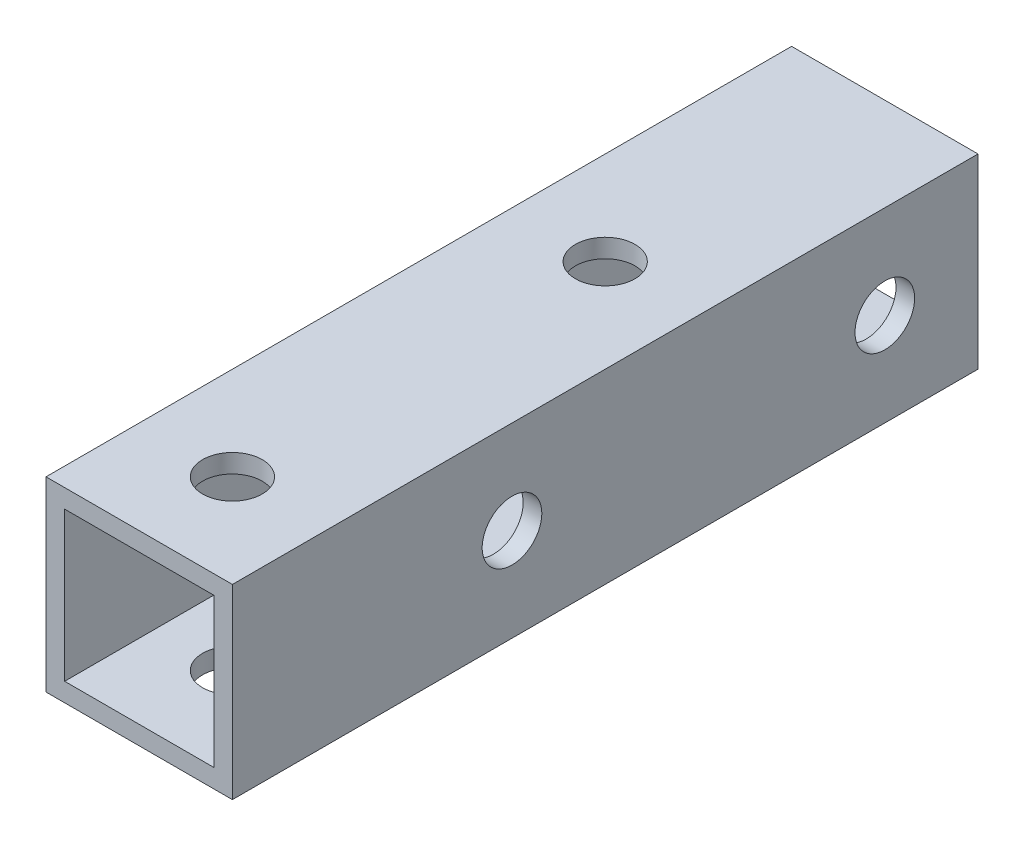
ISO-10303-21;
HEADER;
FILE_DESCRIPTION(('STEP AP214'),'2;1');
FILE_NAME('part.step','',(''),(''),'','','');
FILE_SCHEMA(('AUTOMOTIVE_DESIGN { 1 0 10303 214 1 1 1 1 }'));
ENDSEC;
DATA;
#1=APPLICATION_CONTEXT('core data for automotive mechanical design processes');
#2=APPLICATION_PROTOCOL_DEFINITION('international standard','automotive_design',2000,#1);
#3=PRODUCT_CONTEXT('',#1,'mechanical');
#4=PRODUCT('Part','Part','',(#3));
#5=PRODUCT_RELATED_PRODUCT_CATEGORY('part','',(#4));
#6=PRODUCT_DEFINITION_FORMATION('','',#4);
#7=PRODUCT_DEFINITION_CONTEXT('part definition',#1,'design');
#8=PRODUCT_DEFINITION('design','',#6,#7);
#9=PRODUCT_DEFINITION_SHAPE('','',#8);
#10=(LENGTH_UNIT() NAMED_UNIT(*) SI_UNIT(.MILLI.,.METRE.));
#11=(NAMED_UNIT(*) PLANE_ANGLE_UNIT() SI_UNIT($,.RADIAN.));
#12=(NAMED_UNIT(*) SI_UNIT($,.STERADIAN.) SOLID_ANGLE_UNIT());
#13=UNCERTAINTY_MEASURE_WITH_UNIT(LENGTH_MEASURE(1.E-05),#10,'distance_accuracy_value','');
#14=(GEOMETRIC_REPRESENTATION_CONTEXT(3) GLOBAL_UNCERTAINTY_ASSIGNED_CONTEXT((#13)) GLOBAL_UNIT_ASSIGNED_CONTEXT((#10,
#11,#12)) REPRESENTATION_CONTEXT('',''));
#15=CARTESIAN_POINT('',(0.,0.,0.));
#16=DIRECTION('',(0.,0.,1.));
#17=DIRECTION('',(1.,0.,0.));
#18=AXIS2_PLACEMENT_3D('',#15,#16,#17);
#19=CARTESIAN_POINT('',(0.,0.,40.));
#20=DIRECTION('',(0.,0.,1.));
#21=DIRECTION('',(1.,0.,0.));
#22=AXIS2_PLACEMENT_3D('',#19,#20,#21);
#23=PLANE('',#22);
#24=DIRECTION('',(0.,1.,0.));
#25=VECTOR('',#24,1.);
#26=CARTESIAN_POINT('',(5.,-5.,40.));
#27=LINE('',#26,#25);
#28=CARTESIAN_POINT('',(5.,-5.,40.));
#29=VERTEX_POINT('',#28);
#30=CARTESIAN_POINT('',(5.,5.,40.));
#31=VERTEX_POINT('',#30);
#32=EDGE_CURVE('E162',#29,#31,#27,.T.);
#33=ORIENTED_EDGE('',*,*,#32,.T.);
#34=DIRECTION('',(-1.,0.,0.));
#35=VECTOR('',#34,1.);
#36=CARTESIAN_POINT('',(-5.,5.,40.));
#37=LINE('',#36,#35);
#38=CARTESIAN_POINT('',(-5.,5.,40.));
#39=VERTEX_POINT('',#38);
#40=EDGE_CURVE('E165',#31,#39,#37,.T.);
#41=ORIENTED_EDGE('',*,*,#40,.T.);
#42=DIRECTION('',(0.,-1.,0.));
#43=VECTOR('',#42,1.);
#44=CARTESIAN_POINT('',(-5.,-5.,40.));
#45=LINE('',#44,#43);
#46=CARTESIAN_POINT('',(-5.,-5.,40.));
#47=VERTEX_POINT('',#46);
#48=EDGE_CURVE('E168',#39,#47,#45,.T.);
#49=ORIENTED_EDGE('',*,*,#48,.T.);
#50=DIRECTION('',(1.,0.,0.));
#51=VECTOR('',#50,1.);
#52=CARTESIAN_POINT('',(-5.,-5.,40.));
#53=LINE('',#52,#51);
#54=EDGE_CURVE('E170',#47,#29,#53,.T.);
#55=ORIENTED_EDGE('',*,*,#54,.T.);
#56=EDGE_LOOP('',(#33,#41,#49,#55));
#57=FACE_BOUND('',#56,.T.);
#58=DIRECTION('',(-1.,0.,0.));
#59=VECTOR('',#58,1.);
#60=CARTESIAN_POINT('',(0.,4.,40.));
#61=LINE('',#60,#59);
#62=CARTESIAN_POINT('',(4.,4.,40.));
#63=VERTEX_POINT('',#62);
#64=CARTESIAN_POINT('',(-4.,4.,40.));
#65=VERTEX_POINT('',#64);
#66=EDGE_CURVE('E132',#63,#65,#61,.T.);
#67=ORIENTED_EDGE('',*,*,#66,.F.);
#68=DIRECTION('',(0.,1.,0.));
#69=VECTOR('',#68,1.);
#70=CARTESIAN_POINT('',(4.,0.,40.));
#71=LINE('',#70,#69);
#72=CARTESIAN_POINT('',(4.,-4.,40.));
#73=VERTEX_POINT('',#72);
#74=EDGE_CURVE('E124',#73,#63,#71,.T.);
#75=ORIENTED_EDGE('',*,*,#74,.F.);
#76=DIRECTION('',(1.,0.,0.));
#77=VECTOR('',#76,1.);
#78=CARTESIAN_POINT('',(0.,-4.,40.));
#79=LINE('',#78,#77);
#80=CARTESIAN_POINT('',(-4.,-4.,40.));
#81=VERTEX_POINT('',#80);
#82=EDGE_CURVE('E146',#81,#73,#79,.T.);
#83=ORIENTED_EDGE('',*,*,#82,.F.);
#84=DIRECTION('',(0.,-1.,0.));
#85=VECTOR('',#84,1.);
#86=CARTESIAN_POINT('',(-4.,0.,40.));
#87=LINE('',#86,#85);
#88=EDGE_CURVE('E144',#65,#81,#87,.T.);
#89=ORIENTED_EDGE('',*,*,#88,.F.);
#90=EDGE_LOOP('',(#67,#75,#83,#89));
#91=FACE_BOUND('',#90,.T.);
#92=ADVANCED_FACE('F57',(#57,#91),#23,.T.);
#93=CARTESIAN_POINT('',(0.,0.,0.));
#94=DIRECTION('',(0.,0.,1.));
#95=DIRECTION('',(1.,0.,0.));
#96=AXIS2_PLACEMENT_3D('',#93,#94,#95);
#97=PLANE('',#96);
#98=DIRECTION('',(0.,1.,0.));
#99=VECTOR('',#98,1.);
#100=CARTESIAN_POINT('',(5.,-5.,0.));
#101=LINE('',#100,#99);
#102=CARTESIAN_POINT('',(5.,-5.,0.));
#103=VERTEX_POINT('',#102);
#104=CARTESIAN_POINT('',(5.,5.,0.));
#105=VERTEX_POINT('',#104);
#106=EDGE_CURVE('E140',#103,#105,#101,.T.);
#107=ORIENTED_EDGE('',*,*,#106,.F.);
#108=DIRECTION('',(1.,0.,0.));
#109=VECTOR('',#108,1.);
#110=CARTESIAN_POINT('',(-5.,-5.,0.));
#111=LINE('',#110,#109);
#112=CARTESIAN_POINT('',(-5.,-5.,0.));
#113=VERTEX_POINT('',#112);
#114=EDGE_CURVE('E166',#113,#103,#111,.T.);
#115=ORIENTED_EDGE('',*,*,#114,.F.);
#116=DIRECTION('',(0.,-1.,0.));
#117=VECTOR('',#116,1.);
#118=CARTESIAN_POINT('',(-5.,-5.,0.));
#119=LINE('',#118,#117);
#120=CARTESIAN_POINT('',(-5.,5.,0.));
#121=VERTEX_POINT('',#120);
#122=EDGE_CURVE('E177',#121,#113,#119,.T.);
#123=ORIENTED_EDGE('',*,*,#122,.F.);
#124=DIRECTION('',(-1.,0.,0.));
#125=VECTOR('',#124,1.);
#126=CARTESIAN_POINT('',(-5.,5.,0.));
#127=LINE('',#126,#125);
#128=EDGE_CURVE('E175',#105,#121,#127,.T.);
#129=ORIENTED_EDGE('',*,*,#128,.F.);
#130=EDGE_LOOP('',(#107,#115,#123,#129));
#131=FACE_BOUND('',#130,.T.);
#132=DIRECTION('',(0.,1.,0.));
#133=VECTOR('',#132,1.);
#134=CARTESIAN_POINT('',(4.,0.,0.));
#135=LINE('',#134,#133);
#136=CARTESIAN_POINT('',(4.,-4.,0.));
#137=VERTEX_POINT('',#136);
#138=CARTESIAN_POINT('',(4.,4.,0.));
#139=VERTEX_POINT('',#138);
#140=EDGE_CURVE('E82',#137,#139,#135,.T.);
#141=ORIENTED_EDGE('',*,*,#140,.T.);
#142=DIRECTION('',(-1.,0.,0.));
#143=VECTOR('',#142,1.);
#144=CARTESIAN_POINT('',(0.,4.,0.));
#145=LINE('',#144,#143);
#146=CARTESIAN_POINT('',(-4.,4.,0.));
#147=VERTEX_POINT('',#146);
#148=EDGE_CURVE('E139',#139,#147,#145,.T.);
#149=ORIENTED_EDGE('',*,*,#148,.T.);
#150=DIRECTION('',(0.,-1.,0.));
#151=VECTOR('',#150,1.);
#152=CARTESIAN_POINT('',(-4.,0.,0.));
#153=LINE('',#152,#151);
#154=CARTESIAN_POINT('',(-4.,-4.,0.));
#155=VERTEX_POINT('',#154);
#156=EDGE_CURVE('E154',#147,#155,#153,.T.);
#157=ORIENTED_EDGE('',*,*,#156,.T.);
#158=DIRECTION('',(1.,0.,0.));
#159=VECTOR('',#158,1.);
#160=CARTESIAN_POINT('',(0.,-4.,0.));
#161=LINE('',#160,#159);
#162=EDGE_CURVE('E133',#155,#137,#161,.T.);
#163=ORIENTED_EDGE('',*,*,#162,.T.);
#164=EDGE_LOOP('',(#141,#149,#157,#163));
#165=FACE_BOUND('',#164,.T.);
#166=ADVANCED_FACE('F265',(#131,#165),#97,.F.);
#167=CARTESIAN_POINT('',(5.,-5.,40.));
#168=DIRECTION('',(-1.,0.,0.));
#169=DIRECTION('',(0.,0.,1.));
#170=AXIS2_PLACEMENT_3D('',#167,#168,#169);
#171=PLANE('',#170);
#172=CARTESIAN_POINT('',(5.,0.,5.));
#173=DIRECTION('',(1.,0.,0.));
#174=DIRECTION('',(0.,0.,-1.));
#175=AXIS2_PLACEMENT_3D('',#172,#173,#174);
#176=CIRCLE('',#175,1.6);
#177=CARTESIAN_POINT('',(5.,0.,3.4));
#178=VERTEX_POINT('',#177);
#179=EDGE_CURVE('E203',#178,#178,#176,.T.);
#180=ORIENTED_EDGE('',*,*,#179,.F.);
#181=EDGE_LOOP('',(#180));
#182=FACE_BOUND('',#181,.T.);
#183=CARTESIAN_POINT('',(5.,0.,25.));
#184=DIRECTION('',(1.,0.,0.));
#185=DIRECTION('',(0.,0.,-1.));
#186=AXIS2_PLACEMENT_3D('',#183,#184,#185);
#187=CIRCLE('',#186,1.6);
#188=CARTESIAN_POINT('',(5.,0.,23.4));
#189=VERTEX_POINT('',#188);
#190=EDGE_CURVE('E213',#189,#189,#187,.T.);
#191=ORIENTED_EDGE('',*,*,#190,.F.);
#192=EDGE_LOOP('',(#191));
#193=FACE_BOUND('',#192,.T.);
#194=ORIENTED_EDGE('',*,*,#106,.T.);
#195=DIRECTION('',(0.,0.,-1.));
#196=VECTOR('',#195,1.);
#197=CARTESIAN_POINT('',(5.,5.,40.));
#198=LINE('',#197,#196);
#199=EDGE_CURVE('E12',#31,#105,#198,.T.);
#200=ORIENTED_EDGE('',*,*,#199,.F.);
#201=ORIENTED_EDGE('',*,*,#32,.F.);
#202=DIRECTION('',(0.,0.,-1.));
#203=VECTOR('',#202,1.);
#204=CARTESIAN_POINT('',(5.,-5.,40.));
#205=LINE('',#204,#203);
#206=EDGE_CURVE('E172',#29,#103,#205,.T.);
#207=ORIENTED_EDGE('',*,*,#206,.T.);
#208=EDGE_LOOP('',(#194,#200,#201,#207));
#209=FACE_BOUND('',#208,.T.);
#210=ADVANCED_FACE('F59',(#182,#193,#209),#171,.F.);
#211=CARTESIAN_POINT('',(-5.,5.,40.));
#212=DIRECTION('',(0.,-1.,0.));
#213=DIRECTION('',(0.,0.,-1.));
#214=AXIS2_PLACEMENT_3D('',#211,#212,#213);
#215=PLANE('',#214);
#216=CARTESIAN_POINT('',(0.,5.,15.));
#217=DIRECTION('',(0.,1.,0.));
#218=DIRECTION('',(0.,0.,1.));
#219=AXIS2_PLACEMENT_3D('',#216,#217,#218);
#220=CIRCLE('',#219,1.6);
#221=CARTESIAN_POINT('',(0.,5.,16.6));
#222=VERTEX_POINT('',#221);
#223=EDGE_CURVE('E222',#222,#222,#220,.T.);
#224=ORIENTED_EDGE('',*,*,#223,.F.);
#225=EDGE_LOOP('',(#224));
#226=FACE_BOUND('',#225,.T.);
#227=CARTESIAN_POINT('',(0.,5.,35.));
#228=DIRECTION('',(0.,1.,0.));
#229=DIRECTION('',(0.,0.,1.));
#230=AXIS2_PLACEMENT_3D('',#227,#228,#229);
#231=CIRCLE('',#230,1.6);
#232=CARTESIAN_POINT('',(0.,5.,36.6));
#233=VERTEX_POINT('',#232);
#234=EDGE_CURVE('E219',#233,#233,#231,.T.);
#235=ORIENTED_EDGE('',*,*,#234,.F.);
#236=EDGE_LOOP('',(#235));
#237=FACE_BOUND('',#236,.T.);
#238=ORIENTED_EDGE('',*,*,#128,.T.);
#239=DIRECTION('',(0.,0.,-1.));
#240=VECTOR('',#239,1.);
#241=CARTESIAN_POINT('',(-5.,5.,40.));
#242=LINE('',#241,#240);
#243=EDGE_CURVE('E66',#39,#121,#242,.T.);
#244=ORIENTED_EDGE('',*,*,#243,.F.);
#245=ORIENTED_EDGE('',*,*,#40,.F.);
#246=ORIENTED_EDGE('',*,*,#199,.T.);
#247=EDGE_LOOP('',(#238,#244,#245,#246));
#248=FACE_BOUND('',#247,.T.);
#249=ADVANCED_FACE('F251',(#226,#237,#248),#215,.F.);
#250=CARTESIAN_POINT('',(-5.,-5.,40.));
#251=DIRECTION('',(1.,0.,0.));
#252=DIRECTION('',(0.,0.,-1.));
#253=AXIS2_PLACEMENT_3D('',#250,#251,#252);
#254=PLANE('',#253);
#255=CARTESIAN_POINT('',(-5.,0.,5.));
#256=DIRECTION('',(1.,0.,0.));
#257=DIRECTION('',(0.,0.,-1.));
#258=AXIS2_PLACEMENT_3D('',#255,#256,#257);
#259=CIRCLE('',#258,1.6);
#260=CARTESIAN_POINT('',(-5.,0.,3.4));
#261=VERTEX_POINT('',#260);
#262=EDGE_CURVE('E197',#261,#261,#259,.T.);
#263=ORIENTED_EDGE('',*,*,#262,.T.);
#264=EDGE_LOOP('',(#263));
#265=FACE_BOUND('',#264,.T.);
#266=CARTESIAN_POINT('',(-5.,0.,25.));
#267=DIRECTION('',(1.,0.,0.));
#268=DIRECTION('',(0.,0.,-1.));
#269=AXIS2_PLACEMENT_3D('',#266,#267,#268);
#270=CIRCLE('',#269,1.6);
#271=CARTESIAN_POINT('',(-5.,0.,23.4));
#272=VERTEX_POINT('',#271);
#273=EDGE_CURVE('E208',#272,#272,#270,.T.);
#274=ORIENTED_EDGE('',*,*,#273,.T.);
#275=EDGE_LOOP('',(#274));
#276=FACE_BOUND('',#275,.T.);
#277=ORIENTED_EDGE('',*,*,#122,.T.);
#278=DIRECTION('',(0.,0.,-1.));
#279=VECTOR('',#278,1.);
#280=CARTESIAN_POINT('',(-5.,-5.,40.));
#281=LINE('',#280,#279);
#282=EDGE_CURVE('E182',#47,#113,#281,.T.);
#283=ORIENTED_EDGE('',*,*,#282,.F.);
#284=ORIENTED_EDGE('',*,*,#48,.F.);
#285=ORIENTED_EDGE('',*,*,#243,.T.);
#286=EDGE_LOOP('',(#277,#283,#284,#285));
#287=FACE_BOUND('',#286,.T.);
#288=ADVANCED_FACE('F254',(#265,#276,#287),#254,.F.);
#289=CARTESIAN_POINT('',(-5.,-5.,40.));
#290=DIRECTION('',(0.,1.,0.));
#291=DIRECTION('',(0.,0.,1.));
#292=AXIS2_PLACEMENT_3D('',#289,#290,#291);
#293=PLANE('',#292);
#294=CARTESIAN_POINT('',(0.,-5.,15.));
#295=DIRECTION('',(0.,1.,0.));
#296=DIRECTION('',(0.,0.,1.));
#297=AXIS2_PLACEMENT_3D('',#294,#295,#296);
#298=CIRCLE('',#297,1.6);
#299=CARTESIAN_POINT('',(0.,-5.,16.6));
#300=VERTEX_POINT('',#299);
#301=EDGE_CURVE('E191',#300,#300,#298,.T.);
#302=ORIENTED_EDGE('',*,*,#301,.T.);
#303=EDGE_LOOP('',(#302));
#304=FACE_BOUND('',#303,.T.);
#305=CARTESIAN_POINT('',(0.,-5.,35.));
#306=DIRECTION('',(0.,1.,0.));
#307=DIRECTION('',(0.,0.,1.));
#308=AXIS2_PLACEMENT_3D('',#305,#306,#307);
#309=CIRCLE('',#308,1.6);
#310=CARTESIAN_POINT('',(0.,-5.,36.6));
#311=VERTEX_POINT('',#310);
#312=EDGE_CURVE('E225',#311,#311,#309,.T.);
#313=ORIENTED_EDGE('',*,*,#312,.T.);
#314=EDGE_LOOP('',(#313));
#315=FACE_BOUND('',#314,.T.);
#316=ORIENTED_EDGE('',*,*,#114,.T.);
#317=ORIENTED_EDGE('',*,*,#206,.F.);
#318=ORIENTED_EDGE('',*,*,#54,.F.);
#319=ORIENTED_EDGE('',*,*,#282,.T.);
#320=EDGE_LOOP('',(#316,#317,#318,#319));
#321=FACE_BOUND('',#320,.T.);
#322=ADVANCED_FACE('F269',(#304,#315,#321),#293,.F.);
#323=CARTESIAN_POINT('',(4.,0.,40.));
#324=DIRECTION('',(-1.,0.,0.));
#325=DIRECTION('',(0.,0.,1.));
#326=AXIS2_PLACEMENT_3D('',#323,#324,#325);
#327=PLANE('',#326);
#328=CARTESIAN_POINT('',(4.,0.,5.));
#329=DIRECTION('',(-1.,0.,0.));
#330=DIRECTION('',(0.,0.,1.));
#331=AXIS2_PLACEMENT_3D('',#328,#329,#330);
#332=CIRCLE('',#331,1.6);
#333=CARTESIAN_POINT('',(4.,0.,6.6));
#334=VERTEX_POINT('',#333);
#335=EDGE_CURVE('E216',#334,#334,#332,.T.);
#336=ORIENTED_EDGE('',*,*,#335,.F.);
#337=EDGE_LOOP('',(#336));
#338=FACE_BOUND('',#337,.T.);
#339=CARTESIAN_POINT('',(4.,0.,25.));
#340=DIRECTION('',(-1.,0.,0.));
#341=DIRECTION('',(0.,0.,1.));
#342=AXIS2_PLACEMENT_3D('',#339,#340,#341);
#343=CIRCLE('',#342,1.6);
#344=CARTESIAN_POINT('',(4.,0.,26.6));
#345=VERTEX_POINT('',#344);
#346=EDGE_CURVE('E196',#345,#345,#343,.T.);
#347=ORIENTED_EDGE('',*,*,#346,.F.);
#348=EDGE_LOOP('',(#347));
#349=FACE_BOUND('',#348,.T.);
#350=ORIENTED_EDGE('',*,*,#140,.F.);
#351=DIRECTION('',(0.,0.,-1.));
#352=VECTOR('',#351,1.);
#353=CARTESIAN_POINT('',(4.,-4.,40.));
#354=LINE('',#353,#352);
#355=EDGE_CURVE('E128',#73,#137,#354,.T.);
#356=ORIENTED_EDGE('',*,*,#355,.F.);
#357=ORIENTED_EDGE('',*,*,#74,.T.);
#358=DIRECTION('',(0.,0.,-1.));
#359=VECTOR('',#358,1.);
#360=CARTESIAN_POINT('',(4.,4.,40.));
#361=LINE('',#360,#359);
#362=EDGE_CURVE('E127',#63,#139,#361,.T.);
#363=ORIENTED_EDGE('',*,*,#362,.T.);
#364=EDGE_LOOP('',(#350,#356,#357,#363));
#365=FACE_BOUND('',#364,.T.);
#366=ADVANCED_FACE('F126',(#338,#349,#365),#327,.T.);
#367=CARTESIAN_POINT('',(0.,4.,40.));
#368=DIRECTION('',(0.,-1.,0.));
#369=DIRECTION('',(0.,0.,-1.));
#370=AXIS2_PLACEMENT_3D('',#367,#368,#369);
#371=PLANE('',#370);
#372=CARTESIAN_POINT('',(0.,4.,15.));
#373=DIRECTION('',(0.,-1.,0.));
#374=DIRECTION('',(0.,0.,-1.));
#375=AXIS2_PLACEMENT_3D('',#372,#373,#374);
#376=CIRCLE('',#375,1.6);
#377=CARTESIAN_POINT('',(0.,4.,13.4));
#378=VERTEX_POINT('',#377);
#379=EDGE_CURVE('E152',#378,#378,#376,.T.);
#380=ORIENTED_EDGE('',*,*,#379,.F.);
#381=EDGE_LOOP('',(#380));
#382=FACE_BOUND('',#381,.T.);
#383=CARTESIAN_POINT('',(0.,4.,35.));
#384=DIRECTION('',(0.,-1.,0.));
#385=DIRECTION('',(0.,0.,-1.));
#386=AXIS2_PLACEMENT_3D('',#383,#384,#385);
#387=CIRCLE('',#386,1.6);
#388=CARTESIAN_POINT('',(0.,4.,33.4));
#389=VERTEX_POINT('',#388);
#390=EDGE_CURVE('E190',#389,#389,#387,.T.);
#391=ORIENTED_EDGE('',*,*,#390,.F.);
#392=EDGE_LOOP('',(#391));
#393=FACE_BOUND('',#392,.T.);
#394=ORIENTED_EDGE('',*,*,#148,.F.);
#395=ORIENTED_EDGE('',*,*,#362,.F.);
#396=ORIENTED_EDGE('',*,*,#66,.T.);
#397=DIRECTION('',(0.,0.,-1.));
#398=VECTOR('',#397,1.);
#399=CARTESIAN_POINT('',(-4.,4.,40.));
#400=LINE('',#399,#398);
#401=EDGE_CURVE('E141',#65,#147,#400,.T.);
#402=ORIENTED_EDGE('',*,*,#401,.T.);
#403=EDGE_LOOP('',(#394,#395,#396,#402));
#404=FACE_BOUND('',#403,.T.);
#405=ADVANCED_FACE('F136',(#382,#393,#404),#371,.T.);
#406=CARTESIAN_POINT('',(-4.,0.,40.));
#407=DIRECTION('',(1.,0.,0.));
#408=DIRECTION('',(0.,0.,-1.));
#409=AXIS2_PLACEMENT_3D('',#406,#407,#408);
#410=PLANE('',#409);
#411=CARTESIAN_POINT('',(-4.,0.,5.));
#412=DIRECTION('',(1.,0.,0.));
#413=DIRECTION('',(0.,0.,-1.));
#414=AXIS2_PLACEMENT_3D('',#411,#412,#413);
#415=CIRCLE('',#414,1.6);
#416=CARTESIAN_POINT('',(-4.,0.,3.4));
#417=VERTEX_POINT('',#416);
#418=EDGE_CURVE('E61',#417,#417,#415,.T.);
#419=ORIENTED_EDGE('',*,*,#418,.F.);
#420=EDGE_LOOP('',(#419));
#421=FACE_BOUND('',#420,.T.);
#422=CARTESIAN_POINT('',(-4.,0.,25.));
#423=DIRECTION('',(1.,0.,0.));
#424=DIRECTION('',(0.,0.,-1.));
#425=AXIS2_PLACEMENT_3D('',#422,#423,#424);
#426=CIRCLE('',#425,1.6);
#427=CARTESIAN_POINT('',(-4.,0.,23.4));
#428=VERTEX_POINT('',#427);
#429=EDGE_CURVE('E194',#428,#428,#426,.T.);
#430=ORIENTED_EDGE('',*,*,#429,.F.);
#431=EDGE_LOOP('',(#430));
#432=FACE_BOUND('',#431,.T.);
#433=ORIENTED_EDGE('',*,*,#156,.F.);
#434=ORIENTED_EDGE('',*,*,#401,.F.);
#435=ORIENTED_EDGE('',*,*,#88,.T.);
#436=DIRECTION('',(0.,0.,-1.));
#437=VECTOR('',#436,1.);
#438=CARTESIAN_POINT('',(-4.,-4.,40.));
#439=LINE('',#438,#437);
#440=EDGE_CURVE('E74',#81,#155,#439,.T.);
#441=ORIENTED_EDGE('',*,*,#440,.T.);
#442=EDGE_LOOP('',(#433,#434,#435,#441));
#443=FACE_BOUND('',#442,.T.);
#444=ADVANCED_FACE('F239',(#421,#432,#443),#410,.T.);
#445=CARTESIAN_POINT('',(0.,-4.,40.));
#446=DIRECTION('',(0.,1.,0.));
#447=DIRECTION('',(0.,0.,1.));
#448=AXIS2_PLACEMENT_3D('',#445,#446,#447);
#449=PLANE('',#448);
#450=CARTESIAN_POINT('',(0.,-4.,15.));
#451=DIRECTION('',(0.,1.,0.));
#452=DIRECTION('',(0.,0.,1.));
#453=AXIS2_PLACEMENT_3D('',#450,#451,#452);
#454=CIRCLE('',#453,1.6);
#455=CARTESIAN_POINT('',(0.,-4.,16.6));
#456=VERTEX_POINT('',#455);
#457=EDGE_CURVE('E192',#456,#456,#454,.T.);
#458=ORIENTED_EDGE('',*,*,#457,.F.);
#459=EDGE_LOOP('',(#458));
#460=FACE_BOUND('',#459,.T.);
#461=CARTESIAN_POINT('',(0.,-4.,35.));
#462=DIRECTION('',(0.,1.,0.));
#463=DIRECTION('',(0.,0.,1.));
#464=AXIS2_PLACEMENT_3D('',#461,#462,#463);
#465=CIRCLE('',#464,1.6);
#466=CARTESIAN_POINT('',(0.,-4.,36.6));
#467=VERTEX_POINT('',#466);
#468=EDGE_CURVE('E187',#467,#467,#465,.T.);
#469=ORIENTED_EDGE('',*,*,#468,.F.);
#470=EDGE_LOOP('',(#469));
#471=FACE_BOUND('',#470,.T.);
#472=ORIENTED_EDGE('',*,*,#162,.F.);
#473=ORIENTED_EDGE('',*,*,#440,.F.);
#474=ORIENTED_EDGE('',*,*,#82,.T.);
#475=ORIENTED_EDGE('',*,*,#355,.T.);
#476=EDGE_LOOP('',(#472,#473,#474,#475));
#477=FACE_BOUND('',#476,.T.);
#478=ADVANCED_FACE('F351',(#460,#471,#477),#449,.T.);
#479=CARTESIAN_POINT('',(0.,-5.,35.));
#480=DIRECTION('',(0.,1.,0.));
#481=DIRECTION('',(0.,0.,1.));
#482=AXIS2_PLACEMENT_3D('',#479,#480,#481);
#483=CYLINDRICAL_SURFACE('',#482,1.6);
#484=ORIENTED_EDGE('',*,*,#468,.T.);
#485=EDGE_LOOP('',(#484));
#486=FACE_BOUND('',#485,.T.);
#487=ORIENTED_EDGE('',*,*,#312,.F.);
#488=EDGE_LOOP('',(#487));
#489=FACE_BOUND('',#488,.T.);
#490=ADVANCED_FACE('F248',(#486,#489),#483,.F.);
#491=CARTESIAN_POINT('',(0.,-5.,15.));
#492=DIRECTION('',(0.,1.,0.));
#493=DIRECTION('',(0.,0.,1.));
#494=AXIS2_PLACEMENT_3D('',#491,#492,#493);
#495=CYLINDRICAL_SURFACE('',#494,1.6);
#496=ORIENTED_EDGE('',*,*,#457,.T.);
#497=EDGE_LOOP('',(#496));
#498=FACE_BOUND('',#497,.T.);
#499=ORIENTED_EDGE('',*,*,#301,.F.);
#500=EDGE_LOOP('',(#499));
#501=FACE_BOUND('',#500,.T.);
#502=ADVANCED_FACE('F246',(#498,#501),#495,.F.);
#503=ORIENTED_EDGE('',*,*,#390,.T.);
#504=EDGE_LOOP('',(#503));
#505=FACE_BOUND('',#504,.T.);
#506=ORIENTED_EDGE('',*,*,#234,.T.);
#507=EDGE_LOOP('',(#506));
#508=FACE_BOUND('',#507,.T.);
#509=ADVANCED_FACE('F243',(#505,#508),#483,.F.);
#510=ORIENTED_EDGE('',*,*,#379,.T.);
#511=EDGE_LOOP('',(#510));
#512=FACE_BOUND('',#511,.T.);
#513=ORIENTED_EDGE('',*,*,#223,.T.);
#514=EDGE_LOOP('',(#513));
#515=FACE_BOUND('',#514,.T.);
#516=ADVANCED_FACE('F234',(#512,#515),#495,.F.);
#517=CARTESIAN_POINT('',(-5.,0.,25.));
#518=DIRECTION('',(1.,0.,0.));
#519=DIRECTION('',(0.,0.,-1.));
#520=AXIS2_PLACEMENT_3D('',#517,#518,#519);
#521=CYLINDRICAL_SURFACE('',#520,1.6);
#522=ORIENTED_EDGE('',*,*,#429,.T.);
#523=EDGE_LOOP('',(#522));
#524=FACE_BOUND('',#523,.T.);
#525=ORIENTED_EDGE('',*,*,#273,.F.);
#526=EDGE_LOOP('',(#525));
#527=FACE_BOUND('',#526,.T.);
#528=ADVANCED_FACE('F291',(#524,#527),#521,.F.);
#529=CARTESIAN_POINT('',(-5.,0.,5.));
#530=DIRECTION('',(1.,0.,0.));
#531=DIRECTION('',(0.,0.,-1.));
#532=AXIS2_PLACEMENT_3D('',#529,#530,#531);
#533=CYLINDRICAL_SURFACE('',#532,1.6);
#534=ORIENTED_EDGE('',*,*,#418,.T.);
#535=EDGE_LOOP('',(#534));
#536=FACE_BOUND('',#535,.T.);
#537=ORIENTED_EDGE('',*,*,#262,.F.);
#538=EDGE_LOOP('',(#537));
#539=FACE_BOUND('',#538,.T.);
#540=ADVANCED_FACE('F293',(#536,#539),#533,.F.);
#541=ORIENTED_EDGE('',*,*,#346,.T.);
#542=EDGE_LOOP('',(#541));
#543=FACE_BOUND('',#542,.T.);
#544=ORIENTED_EDGE('',*,*,#190,.T.);
#545=EDGE_LOOP('',(#544));
#546=FACE_BOUND('',#545,.T.);
#547=ADVANCED_FACE('F295',(#543,#546),#521,.F.);
#548=ORIENTED_EDGE('',*,*,#335,.T.);
#549=EDGE_LOOP('',(#548));
#550=FACE_BOUND('',#549,.T.);
#551=ORIENTED_EDGE('',*,*,#179,.T.);
#552=EDGE_LOOP('',(#551));
#553=FACE_BOUND('',#552,.T.);
#554=ADVANCED_FACE('F302',(#550,#553),#533,.F.);
#555=CLOSED_SHELL('',(#92,#166,#210,#249,#288,#322,#366,#405,#444,#478,#490,#502,#509,#516,#528,
#540,#547,#554));
#556=MANIFOLD_SOLID_BREP('B2',#555);
#557=ADVANCED_BREP_SHAPE_REPRESENTATION('',(#18,#556),#14);
#558=SHAPE_DEFINITION_REPRESENTATION(#9,#557);
ENDSEC;
END-ISO-10303-21;
